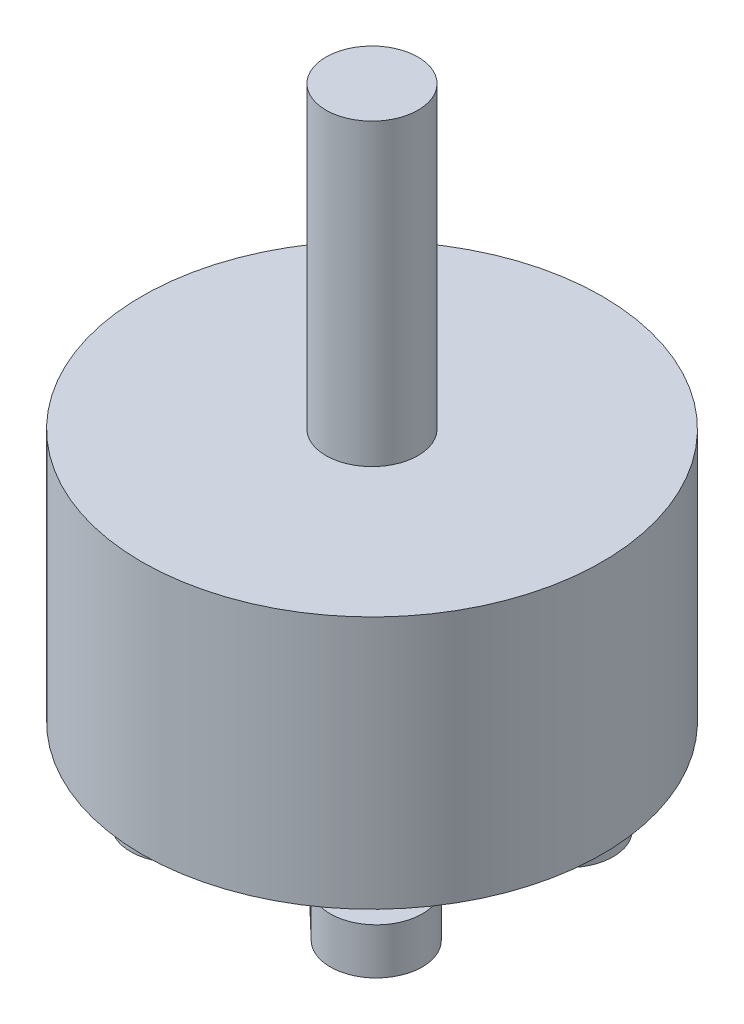
ISO-10303-21;
HEADER;
FILE_DESCRIPTION(('STEP AP214'),'2;1');
FILE_NAME('part.step','',(''),(''),'','','');
FILE_SCHEMA(('AUTOMOTIVE_DESIGN { 1 0 10303 214 1 1 1 1 }'));
ENDSEC;
DATA;
#1=APPLICATION_CONTEXT('core data for automotive mechanical design processes');
#2=APPLICATION_PROTOCOL_DEFINITION('international standard','automotive_design',2000,#1);
#3=PRODUCT_CONTEXT('',#1,'mechanical');
#4=PRODUCT('Part','Part','',(#3));
#5=PRODUCT_RELATED_PRODUCT_CATEGORY('part','',(#4));
#6=PRODUCT_DEFINITION_FORMATION('','',#4);
#7=PRODUCT_DEFINITION_CONTEXT('part definition',#1,'design');
#8=PRODUCT_DEFINITION('design','',#6,#7);
#9=PRODUCT_DEFINITION_SHAPE('','',#8);
#10=(LENGTH_UNIT() NAMED_UNIT(*) SI_UNIT(.MILLI.,.METRE.));
#11=(NAMED_UNIT(*) PLANE_ANGLE_UNIT() SI_UNIT($,.RADIAN.));
#12=(NAMED_UNIT(*) SI_UNIT($,.STERADIAN.) SOLID_ANGLE_UNIT());
#13=UNCERTAINTY_MEASURE_WITH_UNIT(LENGTH_MEASURE(1.E-05),#10,'distance_accuracy_value','');
#14=(GEOMETRIC_REPRESENTATION_CONTEXT(3) GLOBAL_UNCERTAINTY_ASSIGNED_CONTEXT((#13)) GLOBAL_UNIT_ASSIGNED_CONTEXT((#10,
#11,#12)) REPRESENTATION_CONTEXT('',''));
#15=CARTESIAN_POINT('',(0.,0.,0.));
#16=DIRECTION('',(0.,0.,1.));
#17=DIRECTION('',(1.,0.,0.));
#18=AXIS2_PLACEMENT_3D('',#15,#16,#17);
#19=CARTESIAN_POINT('',(0.,2.,0.));
#20=DIRECTION('',(0.,-1.,0.));
#21=DIRECTION('',(0.,0.,-1.));
#22=AXIS2_PLACEMENT_3D('',#19,#20,#21);
#23=PLANE('',#22);
#24=CARTESIAN_POINT('',(-4.32280078412933,2.,-4.16107677019497));
#25=DIRECTION('',(0.,-1.,0.));
#26=DIRECTION('',(0.,0.,-1.));
#27=AXIS2_PLACEMENT_3D('',#24,#25,#26);
#28=CIRCLE('',#27,1.);
#29=CARTESIAN_POINT('',(-4.32280078412933,2.,-5.16107677019497));
#30=VERTEX_POINT('',#29);
#31=EDGE_CURVE('E603',#30,#30,#28,.T.);
#32=ORIENTED_EDGE('',*,*,#31,.F.);
#33=EDGE_LOOP('',(#32));
#34=FACE_BOUND('',#33,.T.);
#35=CARTESIAN_POINT('',(4.35475015535298,2.,-4.12789438657211));
#36=DIRECTION('',(0.,-1.,0.));
#37=DIRECTION('',(0.,0.,-1.));
#38=AXIS2_PLACEMENT_3D('',#35,#36,#37);
#39=CIRCLE('',#38,1.);
#40=CARTESIAN_POINT('',(4.35475015535298,2.,-5.12789438657211));
#41=VERTEX_POINT('',#40);
#42=EDGE_CURVE('E599',#41,#41,#39,.T.);
#43=ORIENTED_EDGE('',*,*,#42,.F.);
#44=EDGE_LOOP('',(#43));
#45=FACE_BOUND('',#44,.T.);
#46=CARTESIAN_POINT('',(4.39052721473409,2.,4.09248549175884));
#47=DIRECTION('',(0.,-1.,0.));
#48=DIRECTION('',(0.,0.,-1.));
#49=AXIS2_PLACEMENT_3D('',#46,#47,#48);
#50=CIRCLE('',#49,1.);
#51=CARTESIAN_POINT('',(4.39052721473409,2.,3.09248549175884));
#52=VERTEX_POINT('',#51);
#53=EDGE_CURVE('E583',#52,#52,#50,.T.);
#54=ORIENTED_EDGE('',*,*,#53,.F.);
#55=EDGE_LOOP('',(#54));
#56=FACE_BOUND('',#55,.T.);
#57=CARTESIAN_POINT('',(-4.28753382427758,2.,4.19955312285191));
#58=DIRECTION('',(0.,-1.,0.));
#59=DIRECTION('',(0.,0.,-1.));
#60=AXIS2_PLACEMENT_3D('',#57,#58,#59);
#61=CIRCLE('',#60,1.);
#62=CARTESIAN_POINT('',(-4.28753382427758,2.,3.19955312285191));
#63=VERTEX_POINT('',#62);
#64=EDGE_CURVE('E575',#63,#63,#61,.T.);
#65=ORIENTED_EDGE('',*,*,#64,.F.);
#66=EDGE_LOOP('',(#65));
#67=FACE_BOUND('',#66,.T.);
#68=CARTESIAN_POINT('',(0.,2.,0.));
#69=DIRECTION('',(0.,-1.,0.));
#70=DIRECTION('',(0.,0.,-1.));
#71=AXIS2_PLACEMENT_3D('',#68,#69,#70);
#72=CIRCLE('',#71,2.);
#73=CARTESIAN_POINT('',(0.,2.,-2.));
#74=VERTEX_POINT('',#73);
#75=EDGE_CURVE('E177',#74,#74,#72,.T.);
#76=ORIENTED_EDGE('',*,*,#75,.F.);
#77=EDGE_LOOP('',(#76));
#78=FACE_BOUND('',#77,.T.);
#79=DIRECTION('',(-0.722425987409892,0.,-0.691448257438575));
#80=VECTOR('',#79,1.);
#81=CARTESIAN_POINT('',(-1.38289651487715,2.,1.44485197481979));
#82=LINE('',#81,#80);
#83=CARTESIAN_POINT('',(-4.33455592445936,2.,-1.38023985586737));
#84=VERTEX_POINT('',#83);
#85=CARTESIAN_POINT('',(-5.71745243933651,2.,-2.70383756981167));
#86=VERTEX_POINT('',#85);
#87=EDGE_CURVE('E169',#84,#86,#82,.T.);
#88=ORIENTED_EDGE('',*,*,#87,.T.);
#89=CARTESIAN_POINT('',(-4.33455592445936,2.,-4.14868954463145));
#90=DIRECTION('',(0.,-1.,0.));
#91=DIRECTION('',(0.,0.,-1.));
#92=AXIS2_PLACEMENT_3D('',#89,#90,#91);
#93=CIRCLE('',#92,2.);
#94=CARTESIAN_POINT('',(-2.9516594095822,2.,-5.59354151945124));
#95=VERTEX_POINT('',#94);
#96=EDGE_CURVE('E11',#86,#95,#93,.T.);
#97=ORIENTED_EDGE('',*,*,#96,.T.);
#98=DIRECTION('',(-0.722425987409892,0.,-0.691448257438575));
#99=VECTOR('',#98,1.);
#100=CARTESIAN_POINT('',(1.38289651487715,2.,-1.44485197481978));
#101=LINE('',#100,#99);
#102=CARTESIAN_POINT('',(-1.44207629422807,2.,-4.14868954463145));
#103=VERTEX_POINT('',#102);
#104=EDGE_CURVE('E41',#103,#95,#101,.T.);
#105=ORIENTED_EDGE('',*,*,#104,.F.);
#106=DIRECTION('',(1.,0.,0.));
#107=VECTOR('',#106,1.);
#108=CARTESIAN_POINT('',(0.,2.,-4.14868954463145));
#109=LINE('',#108,#107);
#110=CARTESIAN_POINT('',(1.44207629422807,2.,-4.14868954463145));
#111=VERTEX_POINT('',#110);
#112=EDGE_CURVE('E230',#103,#111,#109,.T.);
#113=ORIENTED_EDGE('',*,*,#112,.T.);
#114=DIRECTION('',(0.722425987409892,0.,-0.691448257438575));
#115=VECTOR('',#114,1.);
#116=CARTESIAN_POINT('',(-1.38289651487715,2.,-1.44485197481978));
#117=LINE('',#116,#115);
#118=CARTESIAN_POINT('',(2.95165940958221,2.,-5.59354151945123));
#119=VERTEX_POINT('',#118);
#120=EDGE_CURVE('E227',#111,#119,#117,.T.);
#121=ORIENTED_EDGE('',*,*,#120,.T.);
#122=CARTESIAN_POINT('',(4.33455592445935,2.,-4.14868954463145));
#123=DIRECTION('',(0.,-1.,0.));
#124=DIRECTION('',(0.,0.,-1.));
#125=AXIS2_PLACEMENT_3D('',#122,#123,#124);
#126=CIRCLE('',#125,2.);
#127=CARTESIAN_POINT('',(5.7174524393365,2.,-2.70383756981166));
#128=VERTEX_POINT('',#127);
#129=EDGE_CURVE('E224',#119,#128,#126,.T.);
#130=ORIENTED_EDGE('',*,*,#129,.T.);
#131=DIRECTION('',(0.722425987409892,0.,-0.691448257438575));
#132=VECTOR('',#131,1.);
#133=CARTESIAN_POINT('',(1.38289651487715,2.,1.44485197481979));
#134=LINE('',#133,#132);
#135=CARTESIAN_POINT('',(4.33455592445935,2.,-1.38023985586737));
#136=VERTEX_POINT('',#135);
#137=EDGE_CURVE('E222',#136,#128,#134,.T.);
#138=ORIENTED_EDGE('',*,*,#137,.F.);
#139=DIRECTION('',(0.,0.,-1.));
#140=VECTOR('',#139,1.);
#141=CARTESIAN_POINT('',(4.33455592445935,2.,0.));
#142=LINE('',#141,#140);
#143=CARTESIAN_POINT('',(4.33455592445935,2.,1.38023985586738));
#144=VERTEX_POINT('',#143);
#145=EDGE_CURVE('E220',#144,#136,#142,.T.);
#146=ORIENTED_EDGE('',*,*,#145,.F.);
#147=DIRECTION('',(-0.722425987409892,0.,-0.691448257438575));
#148=VECTOR('',#147,1.);
#149=CARTESIAN_POINT('',(1.38289651487715,2.,-1.44485197481978));
#150=LINE('',#149,#148);
#151=CARTESIAN_POINT('',(5.7174524393365,2.,2.70383756981167));
#152=VERTEX_POINT('',#151);
#153=EDGE_CURVE('E218',#152,#144,#150,.T.);
#154=ORIENTED_EDGE('',*,*,#153,.F.);
#155=CARTESIAN_POINT('',(4.33455592445935,2.,4.14868954463145));
#156=DIRECTION('',(0.,-1.,0.));
#157=DIRECTION('',(0.,0.,-1.));
#158=AXIS2_PLACEMENT_3D('',#155,#156,#157);
#159=CIRCLE('',#158,2.);
#160=CARTESIAN_POINT('',(2.9516594095822,2.,5.59354151945124));
#161=VERTEX_POINT('',#160);
#162=EDGE_CURVE('E215',#152,#161,#159,.T.);
#163=ORIENTED_EDGE('',*,*,#162,.T.);
#164=DIRECTION('',(-0.722425987409892,0.,-0.691448257438575));
#165=VECTOR('',#164,1.);
#166=CARTESIAN_POINT('',(-1.38289651487715,2.,1.44485197481979));
#167=LINE('',#166,#165);
#168=CARTESIAN_POINT('',(1.44207629422806,2.,4.14868954463145));
#169=VERTEX_POINT('',#168);
#170=EDGE_CURVE('E212',#161,#169,#167,.T.);
#171=ORIENTED_EDGE('',*,*,#170,.T.);
#172=DIRECTION('',(1.,0.,0.));
#173=VECTOR('',#172,1.);
#174=CARTESIAN_POINT('',(0.,2.,4.14868954463145));
#175=LINE('',#174,#173);
#176=CARTESIAN_POINT('',(-1.44207629422806,2.,4.14868954463145));
#177=VERTEX_POINT('',#176);
#178=EDGE_CURVE('E210',#177,#169,#175,.T.);
#179=ORIENTED_EDGE('',*,*,#178,.F.);
#180=DIRECTION('',(0.722425987409892,0.,-0.691448257438575));
#181=VECTOR('',#180,1.);
#182=CARTESIAN_POINT('',(1.38289651487715,2.,1.44485197481979));
#183=LINE('',#182,#181);
#184=CARTESIAN_POINT('',(-2.95165940958221,2.,5.59354151945124));
#185=VERTEX_POINT('',#184);
#186=EDGE_CURVE('E208',#185,#177,#183,.T.);
#187=ORIENTED_EDGE('',*,*,#186,.F.);
#188=CARTESIAN_POINT('',(-4.33455592445936,2.,4.14868954463145));
#189=DIRECTION('',(0.,-1.,0.));
#190=DIRECTION('',(0.,0.,-1.));
#191=AXIS2_PLACEMENT_3D('',#188,#189,#190);
#192=CIRCLE('',#191,2.);
#193=CARTESIAN_POINT('',(-5.7174524393365,2.,2.70383756981167));
#194=VERTEX_POINT('',#193);
#195=EDGE_CURVE('E205',#185,#194,#192,.T.);
#196=ORIENTED_EDGE('',*,*,#195,.T.);
#197=DIRECTION('',(0.722425987409892,0.,-0.691448257438575));
#198=VECTOR('',#197,1.);
#199=CARTESIAN_POINT('',(-1.38289651487715,2.,-1.44485197481978));
#200=LINE('',#199,#198);
#201=CARTESIAN_POINT('',(-4.33455592445936,2.,1.38023985586738));
#202=VERTEX_POINT('',#201);
#203=EDGE_CURVE('E202',#194,#202,#200,.T.);
#204=ORIENTED_EDGE('',*,*,#203,.T.);
#205=DIRECTION('',(0.,0.,-1.));
#206=VECTOR('',#205,1.);
#207=CARTESIAN_POINT('',(-4.33455592445936,2.,0.));
#208=LINE('',#207,#206);
#209=EDGE_CURVE('E200',#202,#84,#208,.T.);
#210=ORIENTED_EDGE('',*,*,#209,.T.);
#211=EDGE_LOOP('',(#88,#97,#105,#113,#121,#130,#138,#146,#154,#163,#171,#179,#187,#196,#204,#210));
#212=FACE_BOUND('',#211,.T.);
#213=ADVANCED_FACE('F33',(#34,#45,#56,#67,#78,#212),#23,.T.);
#214=CARTESIAN_POINT('',(0.,2.,0.));
#215=DIRECTION('',(0.,-1.,0.));
#216=DIRECTION('',(0.,0.,-1.));
#217=AXIS2_PLACEMENT_3D('',#214,#215,#216);
#218=CYLINDRICAL_SURFACE('',#217,2.);
#219=CARTESIAN_POINT('',(0.,1.,0.));
#220=DIRECTION('',(0.,-1.,0.));
#221=DIRECTION('',(0.,0.,-1.));
#222=AXIS2_PLACEMENT_3D('',#219,#220,#221);
#223=CIRCLE('',#222,2.);
#224=CARTESIAN_POINT('',(0.,1.,-2.));
#225=VERTEX_POINT('',#224);
#226=EDGE_CURVE('E180',#225,#225,#223,.T.);
#227=ORIENTED_EDGE('',*,*,#226,.F.);
#228=EDGE_LOOP('',(#227));
#229=FACE_BOUND('',#228,.T.);
#230=ORIENTED_EDGE('',*,*,#75,.T.);
#231=EDGE_LOOP('',(#230));
#232=FACE_BOUND('',#231,.T.);
#233=ADVANCED_FACE('F330',(#229,#232),#218,.T.);
#234=CARTESIAN_POINT('',(0.,0.,0.));
#235=DIRECTION('',(0.,1.,0.));
#236=DIRECTION('',(0.,0.,1.));
#237=AXIS2_PLACEMENT_3D('',#234,#235,#236);
#238=PLANE('',#237);
#239=CARTESIAN_POINT('',(0.,0.,0.));
#240=DIRECTION('',(0.,-1.,0.));
#241=DIRECTION('',(0.,0.,-1.));
#242=AXIS2_PLACEMENT_3D('',#239,#240,#241);
#243=CIRCLE('',#242,1.);
#244=CARTESIAN_POINT('',(0.,0.,-1.));
#245=VERTEX_POINT('',#244);
#246=EDGE_CURVE('E186',#245,#245,#243,.T.);
#247=ORIENTED_EDGE('',*,*,#246,.T.);
#248=EDGE_LOOP('',(#247));
#249=FACE_BOUND('',#248,.T.);
#250=ADVANCED_FACE('F338',(#249),#238,.F.);
#251=CARTESIAN_POINT('',(0.,1.,0.));
#252=DIRECTION('',(0.,-1.,0.));
#253=DIRECTION('',(0.,0.,-1.));
#254=AXIS2_PLACEMENT_3D('',#251,#252,#253);
#255=CYLINDRICAL_SURFACE('',#254,1.);
#256=CARTESIAN_POINT('',(0.,1.,0.));
#257=DIRECTION('',(0.,-1.,0.));
#258=DIRECTION('',(0.,0.,-1.));
#259=AXIS2_PLACEMENT_3D('',#256,#257,#258);
#260=CIRCLE('',#259,1.);
#261=CARTESIAN_POINT('',(0.,1.,-1.));
#262=VERTEX_POINT('',#261);
#263=EDGE_CURVE('E182',#262,#262,#260,.T.);
#264=ORIENTED_EDGE('',*,*,#263,.T.);
#265=EDGE_LOOP('',(#264));
#266=FACE_BOUND('',#265,.T.);
#267=ORIENTED_EDGE('',*,*,#246,.F.);
#268=EDGE_LOOP('',(#267));
#269=FACE_BOUND('',#268,.T.);
#270=ADVANCED_FACE('F345',(#266,#269),#255,.T.);
#271=CARTESIAN_POINT('',(0.,1.,0.));
#272=DIRECTION('',(0.,-1.,0.));
#273=DIRECTION('',(0.,0.,-1.));
#274=AXIS2_PLACEMENT_3D('',#271,#272,#273);
#275=PLANE('',#274);
#276=ORIENTED_EDGE('',*,*,#263,.F.);
#277=EDGE_LOOP('',(#276));
#278=FACE_BOUND('',#277,.T.);
#279=ORIENTED_EDGE('',*,*,#226,.T.);
#280=EDGE_LOOP('',(#279));
#281=FACE_BOUND('',#280,.T.);
#282=ADVANCED_FACE('F348',(#278,#281),#275,.T.);
#283=CARTESIAN_POINT('',(-4.33455592445936,4.,-4.14868954463145));
#284=DIRECTION('',(0.,-1.,0.));
#285=DIRECTION('',(0.,0.,-1.));
#286=AXIS2_PLACEMENT_3D('',#283,#284,#285);
#287=CYLINDRICAL_SURFACE('',#286,2.);
#288=DIRECTION('',(0.,-1.,0.));
#289=VECTOR('',#288,1.);
#290=CARTESIAN_POINT('',(-5.71745243933651,4.,-2.70383756981167));
#291=LINE('',#290,#289);
#292=CARTESIAN_POINT('',(-5.71745243933651,4.,-2.70383756981167));
#293=VERTEX_POINT('',#292);
#294=EDGE_CURVE('E48',#293,#86,#291,.T.);
#295=ORIENTED_EDGE('',*,*,#294,.F.);
#296=CARTESIAN_POINT('',(-4.33455592445936,4.,-4.14868954463145));
#297=DIRECTION('',(0.,-1.,0.));
#298=DIRECTION('',(0.,0.,-1.));
#299=AXIS2_PLACEMENT_3D('',#296,#297,#298);
#300=CIRCLE('',#299,2.);
#301=CARTESIAN_POINT('',(-2.95165940958221,4.,-5.59354151945124));
#302=VERTEX_POINT('',#301);
#303=EDGE_CURVE('E153',#293,#302,#300,.T.);
#304=ORIENTED_EDGE('',*,*,#303,.T.);
#305=DIRECTION('',(0.,-1.,0.));
#306=VECTOR('',#305,1.);
#307=CARTESIAN_POINT('',(-2.9516594095822,4.,-5.59354151945124));
#308=LINE('',#307,#306);
#309=EDGE_CURVE('E181',#302,#95,#308,.T.);
#310=ORIENTED_EDGE('',*,*,#309,.T.);
#311=ORIENTED_EDGE('',*,*,#96,.F.);
#312=EDGE_LOOP('',(#295,#304,#310,#311));
#313=FACE_BOUND('',#312,.T.);
#314=ADVANCED_FACE('F352',(#313),#287,.T.);
#315=CARTESIAN_POINT('',(1.38289651487715,4.,-1.44485197481978));
#316=DIRECTION('',(-0.691448257438575,0.,0.722425987409892));
#317=DIRECTION('',(0.722425987409892,0.,0.691448257438575));
#318=AXIS2_PLACEMENT_3D('',#315,#316,#317);
#319=PLANE('',#318);
#320=ORIENTED_EDGE('',*,*,#104,.T.);
#321=ORIENTED_EDGE('',*,*,#309,.F.);
#322=DIRECTION('',(-0.722425987409892,0.,-0.691448257438575));
#323=VECTOR('',#322,1.);
#324=CARTESIAN_POINT('',(1.38289651487715,4.,-1.44485197481978));
#325=LINE('',#324,#323);
#326=CARTESIAN_POINT('',(-1.44207629422807,4.,-4.14868954463145));
#327=VERTEX_POINT('',#326);
#328=EDGE_CURVE('E173',#327,#302,#325,.T.);
#329=ORIENTED_EDGE('',*,*,#328,.F.);
#330=DIRECTION('',(0.,-1.,0.));
#331=VECTOR('',#330,1.);
#332=CARTESIAN_POINT('',(-1.44207629422807,4.,-4.14868954463145));
#333=LINE('',#332,#331);
#334=EDGE_CURVE('E238',#327,#103,#333,.T.);
#335=ORIENTED_EDGE('',*,*,#334,.T.);
#336=EDGE_LOOP('',(#320,#321,#329,#335));
#337=FACE_BOUND('',#336,.T.);
#338=ADVANCED_FACE('F242',(#337),#319,.F.);
#339=CARTESIAN_POINT('',(0.,4.,-4.14868954463145));
#340=DIRECTION('',(0.,0.,-1.));
#341=DIRECTION('',(-1.,0.,0.));
#342=AXIS2_PLACEMENT_3D('',#339,#340,#341);
#343=PLANE('',#342);
#344=ORIENTED_EDGE('',*,*,#334,.F.);
#345=DIRECTION('',(1.,0.,0.));
#346=VECTOR('',#345,1.);
#347=CARTESIAN_POINT('',(0.,4.,-4.14868954463145));
#348=LINE('',#347,#346);
#349=CARTESIAN_POINT('',(1.44207629422807,4.,-4.14868954463145));
#350=VERTEX_POINT('',#349);
#351=EDGE_CURVE('E310',#327,#350,#348,.T.);
#352=ORIENTED_EDGE('',*,*,#351,.T.);
#353=DIRECTION('',(0.,-1.,0.));
#354=VECTOR('',#353,1.);
#355=CARTESIAN_POINT('',(1.44207629422807,4.,-4.14868954463145));
#356=LINE('',#355,#354);
#357=EDGE_CURVE('E241',#350,#111,#356,.T.);
#358=ORIENTED_EDGE('',*,*,#357,.T.);
#359=ORIENTED_EDGE('',*,*,#112,.F.);
#360=EDGE_LOOP('',(#344,#352,#358,#359));
#361=FACE_BOUND('',#360,.T.);
#362=ADVANCED_FACE('F236',(#361),#343,.T.);
#363=CARTESIAN_POINT('',(-1.38289651487715,4.,-1.44485197481978));
#364=DIRECTION('',(-0.691448257438575,0.,-0.722425987409892));
#365=DIRECTION('',(-0.722425987409892,0.,0.691448257438575));
#366=AXIS2_PLACEMENT_3D('',#363,#364,#365);
#367=PLANE('',#366);
#368=ORIENTED_EDGE('',*,*,#357,.F.);
#369=DIRECTION('',(0.722425987409892,0.,-0.691448257438575));
#370=VECTOR('',#369,1.);
#371=CARTESIAN_POINT('',(-1.38289651487715,4.,-1.44485197481978));
#372=LINE('',#371,#370);
#373=CARTESIAN_POINT('',(2.9516594095822,4.,-5.59354151945123));
#374=VERTEX_POINT('',#373);
#375=EDGE_CURVE('E309',#350,#374,#372,.T.);
#376=ORIENTED_EDGE('',*,*,#375,.T.);
#377=DIRECTION('',(0.,-1.,0.));
#378=VECTOR('',#377,1.);
#379=CARTESIAN_POINT('',(2.95165940958221,4.,-5.59354151945123));
#380=LINE('',#379,#378);
#381=EDGE_CURVE('E245',#374,#119,#380,.T.);
#382=ORIENTED_EDGE('',*,*,#381,.T.);
#383=ORIENTED_EDGE('',*,*,#120,.F.);
#384=EDGE_LOOP('',(#368,#376,#382,#383));
#385=FACE_BOUND('',#384,.T.);
#386=ADVANCED_FACE('F318',(#385),#367,.T.);
#387=CARTESIAN_POINT('',(4.33455592445935,4.,-4.14868954463145));
#388=DIRECTION('',(0.,-1.,0.));
#389=DIRECTION('',(0.,0.,-1.));
#390=AXIS2_PLACEMENT_3D('',#387,#388,#389);
#391=CYLINDRICAL_SURFACE('',#390,2.);
#392=ORIENTED_EDGE('',*,*,#381,.F.);
#393=CARTESIAN_POINT('',(4.33455592445935,4.,-4.14868954463145));
#394=DIRECTION('',(0.,-1.,0.));
#395=DIRECTION('',(0.,0.,-1.));
#396=AXIS2_PLACEMENT_3D('',#393,#394,#395);
#397=CIRCLE('',#396,2.);
#398=CARTESIAN_POINT('',(5.7174524393365,4.,-2.70383756981166));
#399=VERTEX_POINT('',#398);
#400=EDGE_CURVE('E307',#374,#399,#397,.T.);
#401=ORIENTED_EDGE('',*,*,#400,.T.);
#402=DIRECTION('',(0.,-1.,0.));
#403=VECTOR('',#402,1.);
#404=CARTESIAN_POINT('',(5.7174524393365,4.,-2.70383756981166));
#405=LINE('',#404,#403);
#406=EDGE_CURVE('E251',#399,#128,#405,.T.);
#407=ORIENTED_EDGE('',*,*,#406,.T.);
#408=ORIENTED_EDGE('',*,*,#129,.F.);
#409=EDGE_LOOP('',(#392,#401,#407,#408));
#410=FACE_BOUND('',#409,.T.);
#411=ADVANCED_FACE('F328',(#410),#391,.T.);
#412=CARTESIAN_POINT('',(1.38289651487715,4.,1.44485197481979));
#413=DIRECTION('',(-0.691448257438575,0.,-0.722425987409892));
#414=DIRECTION('',(-0.722425987409892,0.,0.691448257438575));
#415=AXIS2_PLACEMENT_3D('',#412,#413,#414);
#416=PLANE('',#415);
#417=ORIENTED_EDGE('',*,*,#137,.T.);
#418=ORIENTED_EDGE('',*,*,#406,.F.);
#419=DIRECTION('',(0.722425987409892,0.,-0.691448257438575));
#420=VECTOR('',#419,1.);
#421=CARTESIAN_POINT('',(1.38289651487715,4.,1.44485197481979));
#422=LINE('',#421,#420);
#423=CARTESIAN_POINT('',(4.33455592445935,4.,-1.38023985586737));
#424=VERTEX_POINT('',#423);
#425=EDGE_CURVE('E298',#424,#399,#422,.T.);
#426=ORIENTED_EDGE('',*,*,#425,.F.);
#427=DIRECTION('',(0.,-1.,0.));
#428=VECTOR('',#427,1.);
#429=CARTESIAN_POINT('',(4.33455592445935,4.,-1.38023985586737));
#430=LINE('',#429,#428);
#431=EDGE_CURVE('E254',#424,#136,#430,.T.);
#432=ORIENTED_EDGE('',*,*,#431,.T.);
#433=EDGE_LOOP('',(#417,#418,#426,#432));
#434=FACE_BOUND('',#433,.T.);
#435=ADVANCED_FACE('F411',(#434),#416,.F.);
#436=CARTESIAN_POINT('',(4.33455592445935,4.,0.));
#437=DIRECTION('',(-1.,0.,0.));
#438=DIRECTION('',(0.,0.,1.));
#439=AXIS2_PLACEMENT_3D('',#436,#437,#438);
#440=PLANE('',#439);
#441=ORIENTED_EDGE('',*,*,#145,.T.);
#442=ORIENTED_EDGE('',*,*,#431,.F.);
#443=DIRECTION('',(0.,0.,-1.));
#444=VECTOR('',#443,1.);
#445=CARTESIAN_POINT('',(4.33455592445935,4.,0.));
#446=LINE('',#445,#444);
#447=CARTESIAN_POINT('',(4.33455592445935,4.,1.38023985586738));
#448=VERTEX_POINT('',#447);
#449=EDGE_CURVE('E305',#448,#424,#446,.T.);
#450=ORIENTED_EDGE('',*,*,#449,.F.);
#451=DIRECTION('',(0.,-1.,0.));
#452=VECTOR('',#451,1.);
#453=CARTESIAN_POINT('',(4.33455592445935,4.,1.38023985586738));
#454=LINE('',#453,#452);
#455=EDGE_CURVE('E257',#448,#144,#454,.T.);
#456=ORIENTED_EDGE('',*,*,#455,.T.);
#457=EDGE_LOOP('',(#441,#442,#450,#456));
#458=FACE_BOUND('',#457,.T.);
#459=ADVANCED_FACE('F418',(#458),#440,.F.);
#460=ORIENTED_EDGE('',*,*,#153,.T.);
#461=ORIENTED_EDGE('',*,*,#455,.F.);
#462=CARTESIAN_POINT('',(5.7174524393365,4.,2.70383756981167));
#463=VERTEX_POINT('',#462);
#464=EDGE_CURVE('E303',#463,#448,#325,.T.);
#465=ORIENTED_EDGE('',*,*,#464,.F.);
#466=DIRECTION('',(0.,-1.,0.));
#467=VECTOR('',#466,1.);
#468=CARTESIAN_POINT('',(5.7174524393365,4.,2.70383756981167));
#469=LINE('',#468,#467);
#470=EDGE_CURVE('E260',#463,#152,#469,.T.);
#471=ORIENTED_EDGE('',*,*,#470,.T.);
#472=EDGE_LOOP('',(#460,#461,#465,#471));
#473=FACE_BOUND('',#472,.T.);
#474=ADVANCED_FACE('F396',(#473),#319,.F.);
#475=CARTESIAN_POINT('',(4.33455592445935,4.,4.14868954463145));
#476=DIRECTION('',(0.,-1.,0.));
#477=DIRECTION('',(0.,0.,-1.));
#478=AXIS2_PLACEMENT_3D('',#475,#476,#477);
#479=CYLINDRICAL_SURFACE('',#478,2.);
#480=ORIENTED_EDGE('',*,*,#470,.F.);
#481=CARTESIAN_POINT('',(4.33455592445935,4.,4.14868954463145));
#482=DIRECTION('',(0.,-1.,0.));
#483=DIRECTION('',(0.,0.,-1.));
#484=AXIS2_PLACEMENT_3D('',#481,#482,#483);
#485=CIRCLE('',#484,2.);
#486=CARTESIAN_POINT('',(2.9516594095822,4.,5.59354151945124));
#487=VERTEX_POINT('',#486);
#488=EDGE_CURVE('E296',#463,#487,#485,.T.);
#489=ORIENTED_EDGE('',*,*,#488,.T.);
#490=DIRECTION('',(0.,-1.,0.));
#491=VECTOR('',#490,1.);
#492=CARTESIAN_POINT('',(2.9516594095822,4.,5.59354151945124));
#493=LINE('',#492,#491);
#494=EDGE_CURVE('E263',#487,#161,#493,.T.);
#495=ORIENTED_EDGE('',*,*,#494,.T.);
#496=ORIENTED_EDGE('',*,*,#162,.F.);
#497=EDGE_LOOP('',(#480,#489,#495,#496));
#498=FACE_BOUND('',#497,.T.);
#499=ADVANCED_FACE('F433',(#498),#479,.T.);
#500=CARTESIAN_POINT('',(-1.38289651487715,4.,1.44485197481979));
#501=DIRECTION('',(-0.691448257438575,0.,0.722425987409892));
#502=DIRECTION('',(0.722425987409892,0.,0.691448257438575));
#503=AXIS2_PLACEMENT_3D('',#500,#501,#502);
#504=PLANE('',#503);
#505=ORIENTED_EDGE('',*,*,#494,.F.);
#506=DIRECTION('',(-0.722425987409892,0.,-0.691448257438575));
#507=VECTOR('',#506,1.);
#508=CARTESIAN_POINT('',(-1.38289651487715,4.,1.44485197481979));
#509=LINE('',#508,#507);
#510=CARTESIAN_POINT('',(1.44207629422806,4.,4.14868954463145));
#511=VERTEX_POINT('',#510);
#512=EDGE_CURVE('E156',#487,#511,#509,.T.);
#513=ORIENTED_EDGE('',*,*,#512,.T.);
#514=DIRECTION('',(0.,-1.,0.));
#515=VECTOR('',#514,1.);
#516=CARTESIAN_POINT('',(1.44207629422806,4.,4.14868954463145));
#517=LINE('',#516,#515);
#518=EDGE_CURVE('E266',#511,#169,#517,.T.);
#519=ORIENTED_EDGE('',*,*,#518,.T.);
#520=ORIENTED_EDGE('',*,*,#170,.F.);
#521=EDGE_LOOP('',(#505,#513,#519,#520));
#522=FACE_BOUND('',#521,.T.);
#523=ADVANCED_FACE('F440',(#522),#504,.T.);
#524=CARTESIAN_POINT('',(0.,4.,4.14868954463145));
#525=DIRECTION('',(0.,0.,-1.));
#526=DIRECTION('',(-1.,0.,0.));
#527=AXIS2_PLACEMENT_3D('',#524,#525,#526);
#528=PLANE('',#527);
#529=ORIENTED_EDGE('',*,*,#178,.T.);
#530=ORIENTED_EDGE('',*,*,#518,.F.);
#531=DIRECTION('',(1.,0.,0.));
#532=VECTOR('',#531,1.);
#533=CARTESIAN_POINT('',(0.,4.,4.14868954463145));
#534=LINE('',#533,#532);
#535=CARTESIAN_POINT('',(-1.44207629422806,4.,4.14868954463145));
#536=VERTEX_POINT('',#535);
#537=EDGE_CURVE('E292',#536,#511,#534,.T.);
#538=ORIENTED_EDGE('',*,*,#537,.F.);
#539=DIRECTION('',(0.,-1.,0.));
#540=VECTOR('',#539,1.);
#541=CARTESIAN_POINT('',(-1.44207629422806,4.,4.14868954463145));
#542=LINE('',#541,#540);
#543=EDGE_CURVE('E269',#536,#177,#542,.T.);
#544=ORIENTED_EDGE('',*,*,#543,.T.);
#545=EDGE_LOOP('',(#529,#530,#538,#544));
#546=FACE_BOUND('',#545,.T.);
#547=ADVANCED_FACE('F290',(#546),#528,.F.);
#548=ORIENTED_EDGE('',*,*,#186,.T.);
#549=ORIENTED_EDGE('',*,*,#543,.F.);
#550=CARTESIAN_POINT('',(-2.95165940958221,4.,5.59354151945124));
#551=VERTEX_POINT('',#550);
#552=EDGE_CURVE('E294',#551,#536,#422,.T.);
#553=ORIENTED_EDGE('',*,*,#552,.F.);
#554=DIRECTION('',(0.,-1.,0.));
#555=VECTOR('',#554,1.);
#556=CARTESIAN_POINT('',(-2.95165940958221,4.,5.59354151945124));
#557=LINE('',#556,#555);
#558=EDGE_CURVE('E272',#551,#185,#557,.T.);
#559=ORIENTED_EDGE('',*,*,#558,.T.);
#560=EDGE_LOOP('',(#548,#549,#553,#559));
#561=FACE_BOUND('',#560,.T.);
#562=ADVANCED_FACE('F286',(#561),#416,.F.);
#563=CARTESIAN_POINT('',(-4.33455592445936,4.,4.14868954463145));
#564=DIRECTION('',(0.,-1.,0.));
#565=DIRECTION('',(0.,0.,-1.));
#566=AXIS2_PLACEMENT_3D('',#563,#564,#565);
#567=CYLINDRICAL_SURFACE('',#566,2.);
#568=ORIENTED_EDGE('',*,*,#558,.F.);
#569=CARTESIAN_POINT('',(-4.33455592445936,4.,4.14868954463145));
#570=DIRECTION('',(0.,-1.,0.));
#571=DIRECTION('',(0.,0.,-1.));
#572=AXIS2_PLACEMENT_3D('',#569,#570,#571);
#573=CIRCLE('',#572,2.);
#574=CARTESIAN_POINT('',(-5.7174524393365,4.,2.70383756981167));
#575=VERTEX_POINT('',#574);
#576=EDGE_CURVE('E280',#551,#575,#573,.T.);
#577=ORIENTED_EDGE('',*,*,#576,.T.);
#578=DIRECTION('',(0.,-1.,0.));
#579=VECTOR('',#578,1.);
#580=CARTESIAN_POINT('',(-5.7174524393365,4.,2.70383756981167));
#581=LINE('',#580,#579);
#582=EDGE_CURVE('E171',#575,#194,#581,.T.);
#583=ORIENTED_EDGE('',*,*,#582,.T.);
#584=ORIENTED_EDGE('',*,*,#195,.F.);
#585=EDGE_LOOP('',(#568,#577,#583,#584));
#586=FACE_BOUND('',#585,.T.);
#587=ADVANCED_FACE('F279',(#586),#567,.T.);
#588=ORIENTED_EDGE('',*,*,#582,.F.);
#589=CARTESIAN_POINT('',(-4.33455592445936,4.,1.38023985586738));
#590=VERTEX_POINT('',#589);
#591=EDGE_CURVE('E165',#575,#590,#372,.T.);
#592=ORIENTED_EDGE('',*,*,#591,.T.);
#593=DIRECTION('',(0.,-1.,0.));
#594=VECTOR('',#593,1.);
#595=CARTESIAN_POINT('',(-4.33455592445936,4.,1.38023985586738));
#596=LINE('',#595,#594);
#597=EDGE_CURVE('E164',#590,#202,#596,.T.);
#598=ORIENTED_EDGE('',*,*,#597,.T.);
#599=ORIENTED_EDGE('',*,*,#203,.F.);
#600=EDGE_LOOP('',(#588,#592,#598,#599));
#601=FACE_BOUND('',#600,.T.);
#602=ADVANCED_FACE('F315',(#601),#367,.T.);
#603=CARTESIAN_POINT('',(-4.33455592445936,4.,0.));
#604=DIRECTION('',(-1.,0.,0.));
#605=DIRECTION('',(0.,0.,1.));
#606=AXIS2_PLACEMENT_3D('',#603,#604,#605);
#607=PLANE('',#606);
#608=ORIENTED_EDGE('',*,*,#597,.F.);
#609=DIRECTION('',(0.,0.,-1.));
#610=VECTOR('',#609,1.);
#611=CARTESIAN_POINT('',(-4.33455592445936,4.,0.));
#612=LINE('',#611,#610);
#613=CARTESIAN_POINT('',(-4.33455592445936,4.,-1.38023985586737));
#614=VERTEX_POINT('',#613);
#615=EDGE_CURVE('E150',#590,#614,#612,.T.);
#616=ORIENTED_EDGE('',*,*,#615,.T.);
#617=DIRECTION('',(0.,-1.,0.));
#618=VECTOR('',#617,1.);
#619=CARTESIAN_POINT('',(-4.33455592445936,4.,-1.38023985586737));
#620=LINE('',#619,#618);
#621=EDGE_CURVE('E161',#614,#84,#620,.T.);
#622=ORIENTED_EDGE('',*,*,#621,.T.);
#623=ORIENTED_EDGE('',*,*,#209,.F.);
#624=EDGE_LOOP('',(#608,#616,#622,#623));
#625=FACE_BOUND('',#624,.T.);
#626=ADVANCED_FACE('F160',(#625),#607,.T.);
#627=ORIENTED_EDGE('',*,*,#621,.F.);
#628=EDGE_CURVE('E146',#614,#293,#509,.T.);
#629=ORIENTED_EDGE('',*,*,#628,.T.);
#630=ORIENTED_EDGE('',*,*,#294,.T.);
#631=ORIENTED_EDGE('',*,*,#87,.F.);
#632=EDGE_LOOP('',(#627,#629,#630,#631));
#633=FACE_BOUND('',#632,.T.);
#634=ADVANCED_FACE('F167',(#633),#504,.T.);
#635=CARTESIAN_POINT('',(0.,6.,0.));
#636=DIRECTION('',(0.,-1.,0.));
#637=DIRECTION('',(0.,0.,-1.));
#638=AXIS2_PLACEMENT_3D('',#635,#636,#637);
#639=PLANE('',#638);
#640=CARTESIAN_POINT('',(0.,6.,0.));
#641=DIRECTION('',(0.,-1.,0.));
#642=DIRECTION('',(0.,0.,-1.));
#643=AXIS2_PLACEMENT_3D('',#640,#641,#642);
#644=CIRCLE('',#643,4.);
#645=CARTESIAN_POINT('',(0.,6.,-4.));
#646=VERTEX_POINT('',#645);
#647=EDGE_CURVE('E578',#646,#646,#644,.T.);
#648=ORIENTED_EDGE('',*,*,#647,.F.);
#649=EDGE_LOOP('',(#648));
#650=FACE_BOUND('',#649,.T.);
#651=CARTESIAN_POINT('',(0.,6.,0.));
#652=DIRECTION('',(0.,-1.,0.));
#653=DIRECTION('',(0.,0.,-1.));
#654=AXIS2_PLACEMENT_3D('',#651,#652,#653);
#655=CIRCLE('',#654,10.);
#656=CARTESIAN_POINT('',(0.,6.,-10.));
#657=VERTEX_POINT('',#656);
#658=EDGE_CURVE('E587',#657,#657,#655,.T.);
#659=ORIENTED_EDGE('',*,*,#658,.T.);
#660=EDGE_LOOP('',(#659));
#661=FACE_BOUND('',#660,.T.);
#662=ADVANCED_FACE('F483',(#650,#661),#639,.T.);
#663=CARTESIAN_POINT('',(0.,4.,0.));
#664=DIRECTION('',(0.,-1.,0.));
#665=DIRECTION('',(0.,0.,-1.));
#666=AXIS2_PLACEMENT_3D('',#663,#664,#665);
#667=PLANE('',#666);
#668=CARTESIAN_POINT('',(-4.32280078412933,4.,-4.16107677019497));
#669=DIRECTION('',(0.,-1.,0.));
#670=DIRECTION('',(0.,0.,-1.));
#671=AXIS2_PLACEMENT_3D('',#668,#669,#670);
#672=CIRCLE('',#671,1.);
#673=CARTESIAN_POINT('',(-4.32280078412933,4.,-5.16107677019497));
#674=VERTEX_POINT('',#673);
#675=EDGE_CURVE('E562',#674,#674,#672,.T.);
#676=ORIENTED_EDGE('',*,*,#675,.T.);
#677=EDGE_LOOP('',(#676));
#678=FACE_BOUND('',#677,.T.);
#679=CARTESIAN_POINT('',(4.35475015535298,4.,-4.12789438657211));
#680=DIRECTION('',(0.,-1.,0.));
#681=DIRECTION('',(0.,0.,-1.));
#682=AXIS2_PLACEMENT_3D('',#679,#680,#681);
#683=CIRCLE('',#682,1.);
#684=CARTESIAN_POINT('',(4.35475015535298,4.,-5.12789438657211));
#685=VERTEX_POINT('',#684);
#686=EDGE_CURVE('E566',#685,#685,#683,.T.);
#687=ORIENTED_EDGE('',*,*,#686,.T.);
#688=EDGE_LOOP('',(#687));
#689=FACE_BOUND('',#688,.T.);
#690=CARTESIAN_POINT('',(4.39052721473409,4.,4.09248549175884));
#691=DIRECTION('',(0.,-1.,0.));
#692=DIRECTION('',(0.,0.,-1.));
#693=AXIS2_PLACEMENT_3D('',#690,#691,#692);
#694=CIRCLE('',#693,1.);
#695=CARTESIAN_POINT('',(4.39052721473409,4.,3.09248549175884));
#696=VERTEX_POINT('',#695);
#697=EDGE_CURVE('E570',#696,#696,#694,.T.);
#698=ORIENTED_EDGE('',*,*,#697,.T.);
#699=EDGE_LOOP('',(#698));
#700=FACE_BOUND('',#699,.T.);
#701=CARTESIAN_POINT('',(-4.28753382427758,4.,4.19955312285191));
#702=DIRECTION('',(0.,-1.,0.));
#703=DIRECTION('',(0.,0.,-1.));
#704=AXIS2_PLACEMENT_3D('',#701,#702,#703);
#705=CIRCLE('',#704,1.);
#706=CARTESIAN_POINT('',(-4.28753382427758,4.,3.19955312285191));
#707=VERTEX_POINT('',#706);
#708=EDGE_CURVE('E573',#707,#707,#705,.T.);
#709=ORIENTED_EDGE('',*,*,#708,.T.);
#710=EDGE_LOOP('',(#709));
#711=FACE_BOUND('',#710,.T.);
#712=ORIENTED_EDGE('',*,*,#303,.F.);
#713=ORIENTED_EDGE('',*,*,#628,.F.);
#714=ORIENTED_EDGE('',*,*,#615,.F.);
#715=ORIENTED_EDGE('',*,*,#591,.F.);
#716=ORIENTED_EDGE('',*,*,#576,.F.);
#717=ORIENTED_EDGE('',*,*,#552,.T.);
#718=ORIENTED_EDGE('',*,*,#537,.T.);
#719=ORIENTED_EDGE('',*,*,#512,.F.);
#720=ORIENTED_EDGE('',*,*,#488,.F.);
#721=ORIENTED_EDGE('',*,*,#464,.T.);
#722=ORIENTED_EDGE('',*,*,#449,.T.);
#723=ORIENTED_EDGE('',*,*,#425,.T.);
#724=ORIENTED_EDGE('',*,*,#400,.F.);
#725=ORIENTED_EDGE('',*,*,#375,.F.);
#726=ORIENTED_EDGE('',*,*,#351,.F.);
#727=ORIENTED_EDGE('',*,*,#328,.T.);
#728=EDGE_LOOP('',(#712,#713,#714,#715,#716,#717,#718,#719,#720,#721,#722,#723,#724,#725,#726,#727));
#729=FACE_BOUND('',#728,.T.);
#730=CARTESIAN_POINT('',(0.,4.,0.));
#731=DIRECTION('',(0.,-1.,0.));
#732=DIRECTION('',(0.,0.,-1.));
#733=AXIS2_PLACEMENT_3D('',#730,#731,#732);
#734=CIRCLE('',#733,4.);
#735=CARTESIAN_POINT('',(0.,4.,-4.));
#736=VERTEX_POINT('',#735);
#737=EDGE_CURVE('E574',#736,#736,#734,.T.);
#738=ORIENTED_EDGE('',*,*,#737,.T.);
#739=EDGE_LOOP('',(#738));
#740=FACE_BOUND('',#739,.T.);
#741=ADVANCED_FACE('F148',(#678,#689,#700,#711,#729,#740),#667,.F.);
#742=CARTESIAN_POINT('',(0.,6.,0.));
#743=DIRECTION('',(0.,-1.,0.));
#744=DIRECTION('',(0.,0.,-1.));
#745=AXIS2_PLACEMENT_3D('',#742,#743,#744);
#746=CYLINDRICAL_SURFACE('',#745,4.);
#747=ORIENTED_EDGE('',*,*,#647,.T.);
#748=EDGE_LOOP('',(#747));
#749=FACE_BOUND('',#748,.T.);
#750=ORIENTED_EDGE('',*,*,#737,.F.);
#751=EDGE_LOOP('',(#750));
#752=FACE_BOUND('',#751,.T.);
#753=ADVANCED_FACE('F364',(#749,#752),#746,.T.);
#754=CARTESIAN_POINT('',(0.,30.,0.));
#755=DIRECTION('',(0.,1.,0.));
#756=DIRECTION('',(0.,0.,1.));
#757=AXIS2_PLACEMENT_3D('',#754,#755,#756);
#758=PLANE('',#757);
#759=CARTESIAN_POINT('',(0.,30.,0.));
#760=DIRECTION('',(0.,1.,0.));
#761=DIRECTION('',(0.,0.,1.));
#762=AXIS2_PLACEMENT_3D('',#759,#760,#761);
#763=CIRCLE('',#762,2.);
#764=CARTESIAN_POINT('',(0.,30.,2.));
#765=VERTEX_POINT('',#764);
#766=EDGE_CURVE('E185',#765,#765,#763,.T.);
#767=ORIENTED_EDGE('',*,*,#766,.T.);
#768=EDGE_LOOP('',(#767));
#769=FACE_BOUND('',#768,.T.);
#770=ADVANCED_FACE('F358',(#769),#758,.T.);
#771=CARTESIAN_POINT('',(0.,17.,0.));
#772=DIRECTION('',(0.,1.,0.));
#773=DIRECTION('',(0.,0.,1.));
#774=AXIS2_PLACEMENT_3D('',#771,#772,#773);
#775=CYLINDRICAL_SURFACE('',#774,2.);
#776=CARTESIAN_POINT('',(0.,17.,0.));
#777=DIRECTION('',(0.,1.,0.));
#778=DIRECTION('',(0.,0.,1.));
#779=AXIS2_PLACEMENT_3D('',#776,#777,#778);
#780=CIRCLE('',#779,2.);
#781=CARTESIAN_POINT('',(0.,17.,2.));
#782=VERTEX_POINT('',#781);
#783=EDGE_CURVE('E189',#782,#782,#780,.T.);
#784=CARTESIAN_POINT('',(0.,17.,2.));
#785=CARTESIAN_POINT('',(0.,17.1354166666667,2.));
#786=CARTESIAN_POINT('',(0.,17.2708333333333,2.));
#787=CARTESIAN_POINT('',(0.,17.5416666666667,2.));
#788=CARTESIAN_POINT('',(0.,17.6770833333333,2.));
#789=CARTESIAN_POINT('',(0.,17.9479166666667,2.));
#790=CARTESIAN_POINT('',(0.,18.0833333333333,2.));
#791=CARTESIAN_POINT('',(0.,18.3541666666667,2.));
#792=CARTESIAN_POINT('',(0.,18.4895833333333,2.));
#793=CARTESIAN_POINT('',(0.,18.7604166666667,2.));
#794=CARTESIAN_POINT('',(0.,18.8958333333333,2.));
#795=CARTESIAN_POINT('',(0.,19.1666666666667,2.));
#796=CARTESIAN_POINT('',(0.,19.3020833333333,2.));
#797=CARTESIAN_POINT('',(0.,19.5729166666667,2.));
#798=CARTESIAN_POINT('',(0.,19.7083333333333,2.));
#799=CARTESIAN_POINT('',(0.,19.9791666666667,2.));
#800=CARTESIAN_POINT('',(0.,20.1145833333333,2.));
#801=CARTESIAN_POINT('',(0.,20.3854166666667,2.));
#802=CARTESIAN_POINT('',(0.,20.5208333333333,2.));
#803=CARTESIAN_POINT('',(0.,20.7916666666667,2.));
#804=CARTESIAN_POINT('',(0.,20.9270833333333,2.));
#805=CARTESIAN_POINT('',(0.,21.1979166666667,2.));
#806=CARTESIAN_POINT('',(0.,21.3333333333333,2.));
#807=CARTESIAN_POINT('',(0.,21.6041666666667,2.));
#808=CARTESIAN_POINT('',(0.,21.7395833333333,2.));
#809=CARTESIAN_POINT('',(0.,22.0104166666667,2.));
#810=CARTESIAN_POINT('',(0.,22.1458333333333,2.));
#811=CARTESIAN_POINT('',(0.,22.4166666666667,2.));
#812=CARTESIAN_POINT('',(0.,22.5520833333333,2.));
#813=CARTESIAN_POINT('',(0.,22.8229166666667,2.));
#814=CARTESIAN_POINT('',(0.,22.9583333333333,2.));
#815=CARTESIAN_POINT('',(0.,23.2291666666667,2.));
#816=CARTESIAN_POINT('',(0.,23.3645833333333,2.));
#817=CARTESIAN_POINT('',(0.,23.6354166666667,2.));
#818=CARTESIAN_POINT('',(0.,23.7708333333333,2.));
#819=CARTESIAN_POINT('',(0.,24.0416666666667,2.));
#820=CARTESIAN_POINT('',(0.,24.1770833333333,2.));
#821=CARTESIAN_POINT('',(0.,24.4479166666667,2.));
#822=CARTESIAN_POINT('',(0.,24.5833333333333,2.));
#823=CARTESIAN_POINT('',(0.,24.8541666666667,2.));
#824=CARTESIAN_POINT('',(0.,24.9895833333333,2.));
#825=CARTESIAN_POINT('',(0.,25.2604166666667,2.));
#826=CARTESIAN_POINT('',(0.,25.3958333333333,2.));
#827=CARTESIAN_POINT('',(0.,25.6666666666667,2.));
#828=CARTESIAN_POINT('',(0.,25.8020833333333,2.));
#829=CARTESIAN_POINT('',(0.,26.0729166666667,2.));
#830=CARTESIAN_POINT('',(0.,26.2083333333333,2.));
#831=CARTESIAN_POINT('',(0.,26.4791666666667,2.));
#832=CARTESIAN_POINT('',(0.,26.6145833333333,2.));
#833=CARTESIAN_POINT('',(0.,26.8854166666667,2.));
#834=CARTESIAN_POINT('',(0.,27.0208333333333,2.));
#835=CARTESIAN_POINT('',(0.,27.2916666666667,2.));
#836=CARTESIAN_POINT('',(0.,27.4270833333333,2.));
#837=CARTESIAN_POINT('',(0.,27.6979166666667,2.));
#838=CARTESIAN_POINT('',(0.,27.8333333333333,2.));
#839=CARTESIAN_POINT('',(0.,28.1041666666667,2.));
#840=CARTESIAN_POINT('',(0.,28.2395833333333,2.));
#841=CARTESIAN_POINT('',(0.,28.5104166666667,2.));
#842=CARTESIAN_POINT('',(0.,28.6458333333333,2.));
#843=CARTESIAN_POINT('',(0.,28.9166666666667,2.));
#844=CARTESIAN_POINT('',(0.,29.0520833333333,2.));
#845=CARTESIAN_POINT('',(0.,29.3229166666667,2.));
#846=CARTESIAN_POINT('',(0.,29.4583333333333,2.));
#847=CARTESIAN_POINT('',(0.,29.7291666666667,2.));
#848=CARTESIAN_POINT('',(0.,29.8645833333333,2.));
#849=CARTESIAN_POINT('',(0.,30.,2.));
#850=B_SPLINE_CURVE_WITH_KNOTS('',3,(#784,#785,#786,#787,#788,#789,#790,#791,#792,#793,#794,
#795,#796,#797,#798,#799,#800,#801,#802,#803,#804,#805,#806,#807,#808,#809,#810,#811,#812,#813,
#814,#815,#816,#817,#818,#819,#820,#821,#822,#823,#824,#825,#826,#827,#828,#829,#830,#831,#832,
#833,#834,#835,#836,#837,#838,#839,#840,#841,#842,#843,#844,#845,#846,#847,#848,#849),
.UNSPECIFIED.,.F.,.F.,(4,2,2,2,2,2,2,2,2,2,2,2,2,2,2,2,2,2,2,2,2,2,2,2,2,2,2,2,2,2,2,2,4),(0.,
0.406249999999997,0.812499999999997,1.21875,1.625,2.03125,2.4375,2.84375,3.25,3.65625,4.0625,
4.46875,4.875,5.28125,5.6875,6.09374999999999,6.5,6.90625,7.3125,7.71875,8.125,8.53125,
8.93749999999999,9.34375,9.74999999999999,10.15625,10.5625,10.96875,11.375,11.78125,12.1875,
12.59375,13.),.UNSPECIFIED.);
#851=EDGE_CURVE('BSEAM354',#782,#765,#850,.T.);
#852=ORIENTED_EDGE('',*,*,#783,.T.);
#853=ORIENTED_EDGE('',*,*,#766,.F.);
#854=ORIENTED_EDGE('',*,*,#851,.T.);
#855=ORIENTED_EDGE('',*,*,#851,.F.);
#856=EDGE_LOOP('',(#852,#854,#853,#855));
#857=FACE_BOUND('',#856,.T.);
#858=ADVANCED_FACE('F354',(#857),#775,.T.);
#859=CARTESIAN_POINT('',(0.,17.,0.));
#860=DIRECTION('',(0.,1.,0.));
#861=DIRECTION('',(0.,0.,1.));
#862=AXIS2_PLACEMENT_3D('',#859,#860,#861);
#863=PLANE('',#862);
#864=CARTESIAN_POINT('',(0.,17.,0.));
#865=DIRECTION('',(0.,1.,0.));
#866=DIRECTION('',(0.,0.,1.));
#867=AXIS2_PLACEMENT_3D('',#864,#865,#866);
#868=CIRCLE('',#867,10.);
#869=CARTESIAN_POINT('',(0.,17.,10.));
#870=VERTEX_POINT('',#869);
#871=EDGE_CURVE('E192',#870,#870,#868,.T.);
#872=ORIENTED_EDGE('',*,*,#871,.T.);
#873=EDGE_LOOP('',(#872));
#874=FACE_BOUND('',#873,.T.);
#875=ORIENTED_EDGE('',*,*,#783,.F.);
#876=EDGE_LOOP('',(#875));
#877=FACE_BOUND('',#876,.T.);
#878=ADVANCED_FACE('F357',(#874,#877),#863,.T.);
#879=CARTESIAN_POINT('',(0.,30.,0.));
#880=DIRECTION('',(0.,-1.,0.));
#881=DIRECTION('',(0.,0.,-1.));
#882=AXIS2_PLACEMENT_3D('',#879,#880,#881);
#883=CYLINDRICAL_SURFACE('',#882,10.);
#884=ORIENTED_EDGE('',*,*,#871,.F.);
#885=EDGE_LOOP('',(#884));
#886=FACE_BOUND('',#885,.T.);
#887=ORIENTED_EDGE('',*,*,#658,.F.);
#888=EDGE_LOOP('',(#887));
#889=FACE_BOUND('',#888,.T.);
#890=ADVANCED_FACE('F35',(#886,#889),#883,.T.);
#891=CARTESIAN_POINT('',(-4.28753382427758,4.,4.19955312285191));
#892=DIRECTION('',(0.,-1.,0.));
#893=DIRECTION('',(0.,0.,-1.));
#894=AXIS2_PLACEMENT_3D('',#891,#892,#893);
#895=CYLINDRICAL_SURFACE('',#894,1.);
#896=ORIENTED_EDGE('',*,*,#708,.F.);
#897=EDGE_LOOP('',(#896));
#898=FACE_BOUND('',#897,.T.);
#899=ORIENTED_EDGE('',*,*,#64,.T.);
#900=EDGE_LOOP('',(#899));
#901=FACE_BOUND('',#900,.T.);
#902=ADVANCED_FACE('F510',(#898,#901),#895,.F.);
#903=CARTESIAN_POINT('',(4.39052721473409,4.,4.09248549175884));
#904=DIRECTION('',(0.,-1.,0.));
#905=DIRECTION('',(0.,0.,-1.));
#906=AXIS2_PLACEMENT_3D('',#903,#904,#905);
#907=CYLINDRICAL_SURFACE('',#906,1.);
#908=ORIENTED_EDGE('',*,*,#697,.F.);
#909=EDGE_LOOP('',(#908));
#910=FACE_BOUND('',#909,.T.);
#911=ORIENTED_EDGE('',*,*,#53,.T.);
#912=EDGE_LOOP('',(#911));
#913=FACE_BOUND('',#912,.T.);
#914=ADVANCED_FACE('F521',(#910,#913),#907,.F.);
#915=CARTESIAN_POINT('',(4.35475015535298,4.,-4.12789438657211));
#916=DIRECTION('',(0.,-1.,0.));
#917=DIRECTION('',(0.,0.,-1.));
#918=AXIS2_PLACEMENT_3D('',#915,#916,#917);
#919=CYLINDRICAL_SURFACE('',#918,1.);
#920=ORIENTED_EDGE('',*,*,#686,.F.);
#921=EDGE_LOOP('',(#920));
#922=FACE_BOUND('',#921,.T.);
#923=ORIENTED_EDGE('',*,*,#42,.T.);
#924=EDGE_LOOP('',(#923));
#925=FACE_BOUND('',#924,.T.);
#926=ADVANCED_FACE('F528',(#922,#925),#919,.F.);
#927=CARTESIAN_POINT('',(-4.32280078412933,4.,-4.16107677019497));
#928=DIRECTION('',(0.,-1.,0.));
#929=DIRECTION('',(0.,0.,-1.));
#930=AXIS2_PLACEMENT_3D('',#927,#928,#929);
#931=CYLINDRICAL_SURFACE('',#930,1.);
#932=ORIENTED_EDGE('',*,*,#675,.F.);
#933=EDGE_LOOP('',(#932));
#934=FACE_BOUND('',#933,.T.);
#935=ORIENTED_EDGE('',*,*,#31,.T.);
#936=EDGE_LOOP('',(#935));
#937=FACE_BOUND('',#936,.T.);
#938=ADVANCED_FACE('F536',(#934,#937),#931,.F.);
#939=CLOSED_SHELL('',(#213,#233,#250,#270,#282,#314,#338,#362,#386,#411,#435,#459,#474,#499,
#523,#547,#562,#587,#602,#626,#634,#662,#741,#753,#770,#858,#878,#890,#902,#914,#926,#938));
#940=MANIFOLD_SOLID_BREP('B2',#939);
#941=ADVANCED_BREP_SHAPE_REPRESENTATION('',(#18,#940),#14);
#942=SHAPE_DEFINITION_REPRESENTATION(#9,#941);
ENDSEC;
END-ISO-10303-21;
